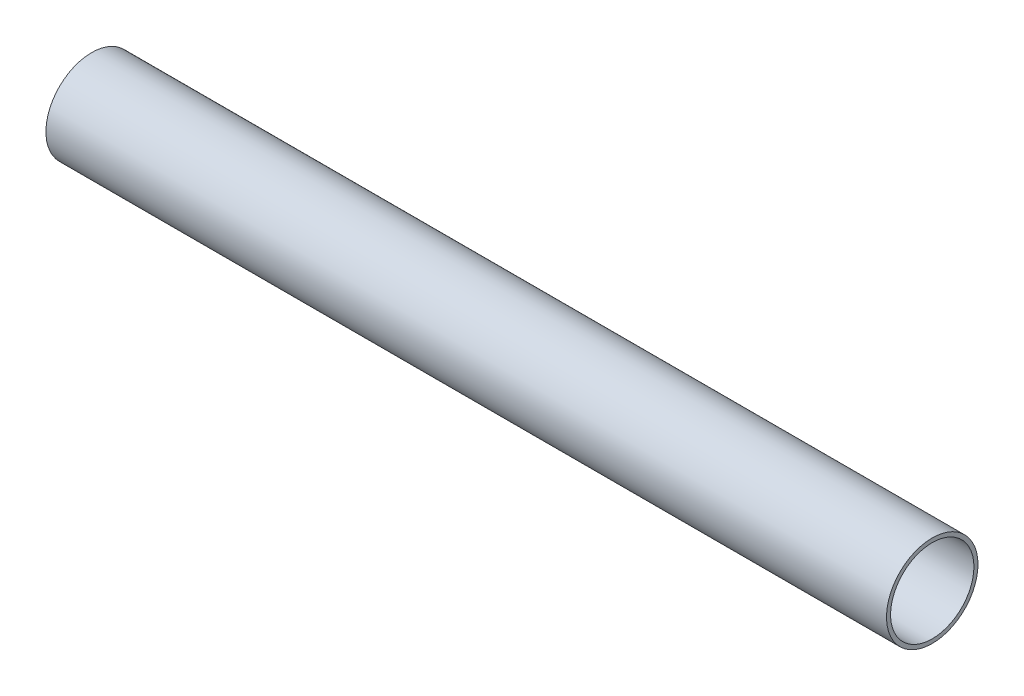
ISO-10303-21;
HEADER;
FILE_DESCRIPTION(('STEP AP214'),'2;1');
FILE_NAME('part.step','',(''),(''),'','','');
FILE_SCHEMA(('AUTOMOTIVE_DESIGN { 1 0 10303 214 1 1 1 1 }'));
ENDSEC;
DATA;
#1=APPLICATION_CONTEXT('core data for automotive mechanical design processes');
#2=APPLICATION_PROTOCOL_DEFINITION('international standard','automotive_design',2000,#1);
#3=PRODUCT_CONTEXT('',#1,'mechanical');
#4=PRODUCT('Part','Part','',(#3));
#5=PRODUCT_RELATED_PRODUCT_CATEGORY('part','',(#4));
#6=PRODUCT_DEFINITION_FORMATION('','',#4);
#7=PRODUCT_DEFINITION_CONTEXT('part definition',#1,'design');
#8=PRODUCT_DEFINITION('design','',#6,#7);
#9=PRODUCT_DEFINITION_SHAPE('','',#8);
#10=(LENGTH_UNIT() NAMED_UNIT(*) SI_UNIT(.MILLI.,.METRE.));
#11=(NAMED_UNIT(*) PLANE_ANGLE_UNIT() SI_UNIT($,.RADIAN.));
#12=(NAMED_UNIT(*) SI_UNIT($,.STERADIAN.) SOLID_ANGLE_UNIT());
#13=UNCERTAINTY_MEASURE_WITH_UNIT(LENGTH_MEASURE(1.E-05),#10,'distance_accuracy_value','');
#14=(GEOMETRIC_REPRESENTATION_CONTEXT(3) GLOBAL_UNCERTAINTY_ASSIGNED_CONTEXT((#13)) GLOBAL_UNIT_ASSIGNED_CONTEXT((#10,
#11,#12)) REPRESENTATION_CONTEXT('',''));
#15=CARTESIAN_POINT('',(0.,0.,0.));
#16=DIRECTION('',(0.,0.,1.));
#17=DIRECTION('',(1.,0.,0.));
#18=AXIS2_PLACEMENT_3D('',#15,#16,#17);
#19=CARTESIAN_POINT('',(51.45,0.,0.));
#20=DIRECTION('',(1.,0.,0.));
#21=DIRECTION('',(0.,0.,-1.));
#22=AXIS2_PLACEMENT_3D('',#19,#20,#21);
#23=PLANE('',#22);
#24=CARTESIAN_POINT('',(51.45,0.,0.));
#25=DIRECTION('',(1.,0.,0.));
#26=DIRECTION('',(0.,0.,-1.));
#27=AXIS2_PLACEMENT_3D('',#24,#25,#26);
#28=CIRCLE('',#27,5.6);
#29=CARTESIAN_POINT('',(51.45,0.,-5.6));
#30=VERTEX_POINT('',#29);
#31=EDGE_CURVE('E10',#30,#30,#28,.T.);
#32=ORIENTED_EDGE('',*,*,#31,.T.);
#33=EDGE_LOOP('',(#32));
#34=FACE_BOUND('',#33,.T.);
#35=CARTESIAN_POINT('',(51.45,0.,0.));
#36=DIRECTION('',(1.,0.,0.));
#37=DIRECTION('',(0.,0.,-1.));
#38=AXIS2_PLACEMENT_3D('',#35,#36,#37);
#39=CIRCLE('',#38,5.1);
#40=CARTESIAN_POINT('',(51.45,0.,-5.1));
#41=VERTEX_POINT('',#40);
#42=EDGE_CURVE('E59',#41,#41,#39,.T.);
#43=ORIENTED_EDGE('',*,*,#42,.F.);
#44=EDGE_LOOP('',(#43));
#45=FACE_BOUND('',#44,.T.);
#46=ADVANCED_FACE('F45',(#34,#45),#23,.T.);
#47=CARTESIAN_POINT('',(-51.45,0.,0.));
#48=DIRECTION('',(1.,0.,0.));
#49=DIRECTION('',(0.,0.,-1.));
#50=AXIS2_PLACEMENT_3D('',#47,#48,#49);
#51=PLANE('',#50);
#52=CARTESIAN_POINT('',(-51.45,0.,0.));
#53=DIRECTION('',(1.,0.,0.));
#54=DIRECTION('',(0.,0.,-1.));
#55=AXIS2_PLACEMENT_3D('',#52,#53,#54);
#56=CIRCLE('',#55,5.6);
#57=CARTESIAN_POINT('',(-51.45,0.,-5.6));
#58=VERTEX_POINT('',#57);
#59=EDGE_CURVE('E49',#58,#58,#56,.T.);
#60=ORIENTED_EDGE('',*,*,#59,.F.);
#61=EDGE_LOOP('',(#60));
#62=FACE_BOUND('',#61,.T.);
#63=CARTESIAN_POINT('',(-51.45,0.,0.));
#64=DIRECTION('',(1.,0.,0.));
#65=DIRECTION('',(0.,0.,-1.));
#66=AXIS2_PLACEMENT_3D('',#63,#64,#65);
#67=CIRCLE('',#66,5.1);
#68=CARTESIAN_POINT('',(-51.45,0.,-5.1));
#69=VERTEX_POINT('',#68);
#70=EDGE_CURVE('E61',#69,#69,#67,.T.);
#71=ORIENTED_EDGE('',*,*,#70,.T.);
#72=EDGE_LOOP('',(#71));
#73=FACE_BOUND('',#72,.T.);
#74=ADVANCED_FACE('F72',(#62,#73),#51,.F.);
#75=CARTESIAN_POINT('',(51.45,0.,0.));
#76=DIRECTION('',(-1.,0.,0.));
#77=DIRECTION('',(0.,0.,1.));
#78=AXIS2_PLACEMENT_3D('',#75,#76,#77);
#79=CYLINDRICAL_SURFACE('',#78,5.6);
#80=ORIENTED_EDGE('',*,*,#31,.F.);
#81=EDGE_LOOP('',(#80));
#82=FACE_BOUND('',#81,.T.);
#83=ORIENTED_EDGE('',*,*,#59,.T.);
#84=EDGE_LOOP('',(#83));
#85=FACE_BOUND('',#84,.T.);
#86=ADVANCED_FACE('F47',(#82,#85),#79,.T.);
#87=CARTESIAN_POINT('',(51.45,0.,0.));
#88=DIRECTION('',(-1.,0.,0.));
#89=DIRECTION('',(0.,0.,1.));
#90=AXIS2_PLACEMENT_3D('',#87,#88,#89);
#91=CYLINDRICAL_SURFACE('',#90,5.1);
#92=ORIENTED_EDGE('',*,*,#42,.T.);
#93=EDGE_LOOP('',(#92));
#94=FACE_BOUND('',#93,.T.);
#95=ORIENTED_EDGE('',*,*,#70,.F.);
#96=EDGE_LOOP('',(#95));
#97=FACE_BOUND('',#96,.T.);
#98=ADVANCED_FACE('F68',(#94,#97),#91,.F.);
#99=CLOSED_SHELL('',(#46,#74,#86,#98));
#100=MANIFOLD_SOLID_BREP('B2',#99);
#101=ADVANCED_BREP_SHAPE_REPRESENTATION('',(#18,#100),#14);
#102=SHAPE_DEFINITION_REPRESENTATION(#9,#101);
ENDSEC;
END-ISO-10303-21;
